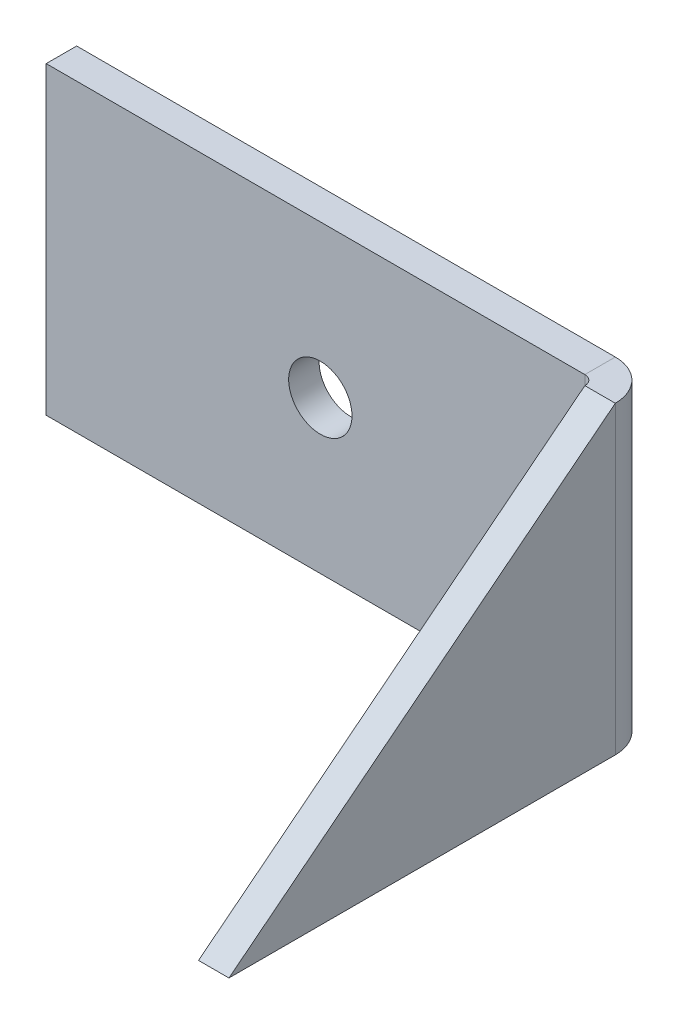
ISO-10303-21;
HEADER;
FILE_DESCRIPTION(('STEP AP214'),'2;1');
FILE_NAME('part.step','',(''),(''),'','','');
FILE_SCHEMA(('AUTOMOTIVE_DESIGN { 1 0 10303 214 1 1 1 1 }'));
ENDSEC;
DATA;
#1=APPLICATION_CONTEXT('core data for automotive mechanical design processes');
#2=APPLICATION_PROTOCOL_DEFINITION('international standard','automotive_design',2000,#1);
#3=PRODUCT_CONTEXT('',#1,'mechanical');
#4=PRODUCT('Part','Part','',(#3));
#5=PRODUCT_RELATED_PRODUCT_CATEGORY('part','',(#4));
#6=PRODUCT_DEFINITION_FORMATION('','',#4);
#7=PRODUCT_DEFINITION_CONTEXT('part definition',#1,'design');
#8=PRODUCT_DEFINITION('design','',#6,#7);
#9=PRODUCT_DEFINITION_SHAPE('','',#8);
#10=(LENGTH_UNIT() NAMED_UNIT(*) SI_UNIT(.MILLI.,.METRE.));
#11=(NAMED_UNIT(*) PLANE_ANGLE_UNIT() SI_UNIT($,.RADIAN.));
#12=(NAMED_UNIT(*) SI_UNIT($,.STERADIAN.) SOLID_ANGLE_UNIT());
#13=UNCERTAINTY_MEASURE_WITH_UNIT(LENGTH_MEASURE(1.E-05),#10,'distance_accuracy_value','');
#14=(GEOMETRIC_REPRESENTATION_CONTEXT(3) GLOBAL_UNCERTAINTY_ASSIGNED_CONTEXT((#13)) GLOBAL_UNIT_ASSIGNED_CONTEXT((#10,
#11,#12)) REPRESENTATION_CONTEXT('',''));
#15=CARTESIAN_POINT('',(0.,0.,0.));
#16=DIRECTION('',(0.,0.,1.));
#17=DIRECTION('',(1.,0.,0.));
#18=AXIS2_PLACEMENT_3D('',#15,#16,#17);
#19=CARTESIAN_POINT('',(-28.575,15.875,3.175));
#20=DIRECTION('',(0.,-1.,0.));
#21=DIRECTION('',(0.,0.,-1.));
#22=AXIS2_PLACEMENT_3D('',#19,#20,#21);
#23=PLANE('',#22);
#24=DIRECTION('',(0.,0.,-1.));
#25=VECTOR('',#24,1.);
#26=CARTESIAN_POINT('',(27.575,15.875,3.17499999999999));
#27=LINE('',#26,#25);
#28=CARTESIAN_POINT('',(27.575,15.875,3.175));
#29=VERTEX_POINT('',#28);
#30=CARTESIAN_POINT('',(27.575,15.875,0.));
#31=VERTEX_POINT('',#30);
#32=EDGE_CURVE('E141',#29,#31,#27,.T.);
#33=ORIENTED_EDGE('',*,*,#32,.T.);
#34=DIRECTION('',(-1.,0.,0.));
#35=VECTOR('',#34,1.);
#36=CARTESIAN_POINT('',(-28.575,15.875,0.));
#37=LINE('',#36,#35);
#38=CARTESIAN_POINT('',(-28.575,15.875,0.));
#39=VERTEX_POINT('',#38);
#40=EDGE_CURVE('E154',#31,#39,#37,.T.);
#41=ORIENTED_EDGE('',*,*,#40,.T.);
#42=DIRECTION('',(0.,0.,-1.));
#43=VECTOR('',#42,1.);
#44=CARTESIAN_POINT('',(-28.575,15.875,3.175));
#45=LINE('',#44,#43);
#46=CARTESIAN_POINT('',(-28.575,15.875,3.175));
#47=VERTEX_POINT('',#46);
#48=EDGE_CURVE('E11',#47,#39,#45,.T.);
#49=ORIENTED_EDGE('',*,*,#48,.F.);
#50=DIRECTION('',(-1.,0.,0.));
#51=VECTOR('',#50,1.);
#52=CARTESIAN_POINT('',(-28.575,15.875,3.175));
#53=LINE('',#52,#51);
#54=EDGE_CURVE('E158',#29,#47,#53,.T.);
#55=ORIENTED_EDGE('',*,*,#54,.F.);
#56=EDGE_LOOP('',(#33,#41,#49,#55));
#57=FACE_BOUND('',#56,.T.);
#58=ADVANCED_FACE('F43',(#57),#23,.F.);
#59=CARTESIAN_POINT('',(-28.575,-15.875,3.175));
#60=DIRECTION('',(0.,1.,0.));
#61=DIRECTION('',(0.,0.,1.));
#62=AXIS2_PLACEMENT_3D('',#59,#60,#61);
#63=PLANE('',#62);
#64=DIRECTION('',(0.,0.,-1.));
#65=VECTOR('',#64,1.);
#66=CARTESIAN_POINT('',(27.575,-15.875,3.17499999999999));
#67=LINE('',#66,#65);
#68=CARTESIAN_POINT('',(27.575,-15.875,3.175));
#69=VERTEX_POINT('',#68);
#70=CARTESIAN_POINT('',(27.575,-15.875,0.));
#71=VERTEX_POINT('',#70);
#72=EDGE_CURVE('E58',#69,#71,#67,.T.);
#73=ORIENTED_EDGE('',*,*,#72,.F.);
#74=DIRECTION('',(1.,0.,0.));
#75=VECTOR('',#74,1.);
#76=CARTESIAN_POINT('',(-28.575,-15.875,3.175));
#77=LINE('',#76,#75);
#78=CARTESIAN_POINT('',(-28.575,-15.875,3.175));
#79=VERTEX_POINT('',#78);
#80=EDGE_CURVE('E165',#79,#69,#77,.T.);
#81=ORIENTED_EDGE('',*,*,#80,.F.);
#82=DIRECTION('',(0.,0.,-1.));
#83=VECTOR('',#82,1.);
#84=CARTESIAN_POINT('',(-28.575,-15.875,3.175));
#85=LINE('',#84,#83);
#86=CARTESIAN_POINT('',(-28.575,-15.875,0.));
#87=VERTEX_POINT('',#86);
#88=EDGE_CURVE('E51',#79,#87,#85,.T.);
#89=ORIENTED_EDGE('',*,*,#88,.T.);
#90=DIRECTION('',(1.,0.,0.));
#91=VECTOR('',#90,1.);
#92=CARTESIAN_POINT('',(-28.575,-15.875,0.));
#93=LINE('',#92,#91);
#94=EDGE_CURVE('E162',#87,#71,#93,.T.);
#95=ORIENTED_EDGE('',*,*,#94,.T.);
#96=EDGE_LOOP('',(#73,#81,#89,#95));
#97=FACE_BOUND('',#96,.T.);
#98=ADVANCED_FACE('F178',(#97),#63,.F.);
#99=CARTESIAN_POINT('',(0.,0.,3.175));
#100=DIRECTION('',(0.,0.,1.));
#101=DIRECTION('',(1.,0.,0.));
#102=AXIS2_PLACEMENT_3D('',#99,#100,#101);
#103=PLANE('',#102);
#104=CARTESIAN_POINT('',(0.,0.,3.175));
#105=DIRECTION('',(0.,0.,1.));
#106=DIRECTION('',(1.,0.,0.));
#107=AXIS2_PLACEMENT_3D('',#104,#105,#106);
#108=CIRCLE('',#107,3.29999999999999);
#109=CARTESIAN_POINT('',(3.29999999999999,0.,3.175));
#110=VERTEX_POINT('',#109);
#111=EDGE_CURVE('E214',#110,#110,#108,.T.);
#112=ORIENTED_EDGE('',*,*,#111,.F.);
#113=EDGE_LOOP('',(#112));
#114=FACE_BOUND('',#113,.T.);
#115=ORIENTED_EDGE('',*,*,#80,.T.);
#116=DIRECTION('',(0.,1.,0.));
#117=VECTOR('',#116,1.);
#118=CARTESIAN_POINT('',(27.575,15.875,3.17499999999999));
#119=LINE('',#118,#117);
#120=EDGE_CURVE('E65',#29,#69,#119,.F.);
#121=ORIENTED_EDGE('',*,*,#120,.F.);
#122=ORIENTED_EDGE('',*,*,#54,.T.);
#123=DIRECTION('',(0.,-1.,0.));
#124=VECTOR('',#123,1.);
#125=CARTESIAN_POINT('',(-28.575,15.875,3.175));
#126=LINE('',#125,#124);
#127=EDGE_CURVE('E161',#47,#79,#126,.T.);
#128=ORIENTED_EDGE('',*,*,#127,.T.);
#129=EDGE_LOOP('',(#115,#121,#122,#128));
#130=FACE_BOUND('',#129,.T.);
#131=ADVANCED_FACE('F221',(#114,#130),#103,.T.);
#132=CARTESIAN_POINT('',(0.,0.,0.));
#133=DIRECTION('',(0.,0.,1.));
#134=DIRECTION('',(1.,0.,0.));
#135=AXIS2_PLACEMENT_3D('',#132,#133,#134);
#136=PLANE('',#135);
#137=CARTESIAN_POINT('',(0.,0.,0.));
#138=DIRECTION('',(0.,0.,1.));
#139=DIRECTION('',(1.,0.,0.));
#140=AXIS2_PLACEMENT_3D('',#137,#138,#139);
#141=CIRCLE('',#140,3.3);
#142=CARTESIAN_POINT('',(3.3,0.,0.));
#143=VERTEX_POINT('',#142);
#144=EDGE_CURVE('E127',#143,#143,#141,.T.);
#145=ORIENTED_EDGE('',*,*,#144,.T.);
#146=EDGE_LOOP('',(#145));
#147=FACE_BOUND('',#146,.T.);
#148=DIRECTION('',(0.,1.,0.));
#149=VECTOR('',#148,1.);
#150=CARTESIAN_POINT('',(27.575,15.875,0.));
#151=LINE('',#150,#149);
#152=EDGE_CURVE('E186',#31,#71,#151,.F.);
#153=ORIENTED_EDGE('',*,*,#152,.T.);
#154=ORIENTED_EDGE('',*,*,#94,.F.);
#155=DIRECTION('',(0.,-1.,0.));
#156=VECTOR('',#155,1.);
#157=CARTESIAN_POINT('',(-28.575,15.875,0.));
#158=LINE('',#157,#156);
#159=EDGE_CURVE('E170',#39,#87,#158,.T.);
#160=ORIENTED_EDGE('',*,*,#159,.F.);
#161=ORIENTED_EDGE('',*,*,#40,.F.);
#162=EDGE_LOOP('',(#153,#154,#160,#161));
#163=FACE_BOUND('',#162,.T.);
#164=ADVANCED_FACE('F183',(#147,#163),#136,.F.);
#165=CARTESIAN_POINT('',(-28.575,15.875,3.175));
#166=DIRECTION('',(1.,0.,0.));
#167=DIRECTION('',(0.,1.,0.));
#168=AXIS2_PLACEMENT_3D('',#165,#166,#167);
#169=PLANE('',#168);
#170=ORIENTED_EDGE('',*,*,#159,.T.);
#171=ORIENTED_EDGE('',*,*,#88,.F.);
#172=ORIENTED_EDGE('',*,*,#127,.F.);
#173=ORIENTED_EDGE('',*,*,#48,.T.);
#174=EDGE_LOOP('',(#170,#171,#172,#173));
#175=FACE_BOUND('',#174,.T.);
#176=ADVANCED_FACE('F248',(#175),#169,.F.);
#177=CARTESIAN_POINT('',(27.575,-15.875,4.175));
#178=DIRECTION('',(0.,-1.,0.));
#179=DIRECTION('',(0.,0.,-1.));
#180=AXIS2_PLACEMENT_3D('',#177,#178,#179);
#181=PLANE('',#180);
#182=DIRECTION('',(1.,0.,0.));
#183=VECTOR('',#182,1.);
#184=CARTESIAN_POINT('',(28.575,-15.875,4.17499999999999));
#185=LINE('',#184,#183);
#186=CARTESIAN_POINT('',(28.575,-15.875,4.17499999999999));
#187=VERTEX_POINT('',#186);
#188=CARTESIAN_POINT('',(31.75,-15.875,4.17499999999998));
#189=VERTEX_POINT('',#188);
#190=EDGE_CURVE('E137',#187,#189,#185,.T.);
#191=ORIENTED_EDGE('',*,*,#190,.F.);
#192=CARTESIAN_POINT('',(27.575,-15.875,4.175));
#193=DIRECTION('',(0.,1.,0.));
#194=DIRECTION('',(0.,0.,1.));
#195=AXIS2_PLACEMENT_3D('',#192,#193,#194);
#196=CIRCLE('',#195,1.);
#197=EDGE_CURVE('E135',#69,#187,#196,.F.);
#198=ORIENTED_EDGE('',*,*,#197,.F.);
#199=ORIENTED_EDGE('',*,*,#72,.T.);
#200=CARTESIAN_POINT('',(27.575,-15.875,4.175));
#201=DIRECTION('',(0.,1.,0.));
#202=DIRECTION('',(0.,0.,1.));
#203=AXIS2_PLACEMENT_3D('',#200,#201,#202);
#204=CIRCLE('',#203,4.175);
#205=EDGE_CURVE('E157',#71,#189,#204,.F.);
#206=ORIENTED_EDGE('',*,*,#205,.T.);
#207=EDGE_LOOP('',(#191,#198,#199,#206));
#208=FACE_BOUND('',#207,.T.);
#209=ADVANCED_FACE('F225',(#208),#181,.T.);
#210=CARTESIAN_POINT('',(27.575,15.875,4.175));
#211=DIRECTION('',(0.,-1.,0.));
#212=DIRECTION('',(0.,0.,-1.));
#213=AXIS2_PLACEMENT_3D('',#210,#211,#212);
#214=PLANE('',#213);
#215=CARTESIAN_POINT('',(27.575,15.875,4.175));
#216=DIRECTION('',(0.,1.,0.));
#217=DIRECTION('',(0.,0.,1.));
#218=AXIS2_PLACEMENT_3D('',#215,#216,#217);
#219=CIRCLE('',#218,1.);
#220=CARTESIAN_POINT('',(28.575,15.875,4.17499999999999));
#221=VERTEX_POINT('',#220);
#222=EDGE_CURVE('E133',#221,#29,#219,.T.);
#223=ORIENTED_EDGE('',*,*,#222,.F.);
#224=DIRECTION('',(1.,0.,0.));
#225=VECTOR('',#224,1.);
#226=CARTESIAN_POINT('',(28.575,15.875,4.17499999999999));
#227=LINE('',#226,#225);
#228=CARTESIAN_POINT('',(31.7500000000001,15.875,4.17499999999998));
#229=VERTEX_POINT('',#228);
#230=EDGE_CURVE('E103',#221,#229,#227,.T.);
#231=ORIENTED_EDGE('',*,*,#230,.T.);
#232=CARTESIAN_POINT('',(27.575,15.875,4.175));
#233=DIRECTION('',(0.,1.,0.));
#234=DIRECTION('',(0.,0.,1.));
#235=AXIS2_PLACEMENT_3D('',#232,#233,#234);
#236=CIRCLE('',#235,4.175);
#237=EDGE_CURVE('E190',#229,#31,#236,.T.);
#238=ORIENTED_EDGE('',*,*,#237,.T.);
#239=ORIENTED_EDGE('',*,*,#32,.F.);
#240=EDGE_LOOP('',(#223,#231,#238,#239));
#241=FACE_BOUND('',#240,.T.);
#242=ADVANCED_FACE('F140',(#241),#214,.F.);
#243=CARTESIAN_POINT('',(27.575,15.875,4.175));
#244=DIRECTION('',(0.,1.,0.));
#245=DIRECTION('',(1.,0.,0.));
#246=AXIS2_PLACEMENT_3D('',#243,#244,#245);
#247=CYLINDRICAL_SURFACE('',#246,4.175);
#248=ORIENTED_EDGE('',*,*,#152,.F.);
#249=ORIENTED_EDGE('',*,*,#237,.F.);
#250=DIRECTION('',(0.,-1.,0.));
#251=VECTOR('',#250,1.);
#252=CARTESIAN_POINT('',(31.75,0.,4.17499999999998));
#253=LINE('',#252,#251);
#254=EDGE_CURVE('E116',#229,#189,#253,.T.);
#255=ORIENTED_EDGE('',*,*,#254,.T.);
#256=ORIENTED_EDGE('',*,*,#205,.F.);
#257=EDGE_LOOP('',(#248,#249,#255,#256));
#258=FACE_BOUND('',#257,.T.);
#259=ADVANCED_FACE('F231',(#258),#247,.T.);
#260=CARTESIAN_POINT('',(27.575,15.875,4.175));
#261=DIRECTION('',(0.,1.,0.));
#262=DIRECTION('',(1.,0.,0.));
#263=AXIS2_PLACEMENT_3D('',#260,#261,#262);
#264=CYLINDRICAL_SURFACE('',#263,1.);
#265=ORIENTED_EDGE('',*,*,#120,.T.);
#266=ORIENTED_EDGE('',*,*,#197,.T.);
#267=DIRECTION('',(0.,1.,0.));
#268=VECTOR('',#267,1.);
#269=CARTESIAN_POINT('',(28.575,-15.875,4.17499999999999));
#270=LINE('',#269,#268);
#271=EDGE_CURVE('E117',#187,#221,#270,.T.);
#272=ORIENTED_EDGE('',*,*,#271,.T.);
#273=ORIENTED_EDGE('',*,*,#222,.T.);
#274=EDGE_LOOP('',(#265,#266,#272,#273));
#275=FACE_BOUND('',#274,.T.);
#276=ADVANCED_FACE('F132',(#275),#264,.F.);
#277=CARTESIAN_POINT('',(31.75,-15.875,3.17499999999999));
#278=DIRECTION('',(0.,1.,0.));
#279=DIRECTION('',(0.,0.,1.));
#280=AXIS2_PLACEMENT_3D('',#277,#278,#279);
#281=PLANE('',#280);
#282=ORIENTED_EDGE('',*,*,#190,.T.);
#283=DIRECTION('',(0.,0.,-1.));
#284=VECTOR('',#283,1.);
#285=CARTESIAN_POINT('',(31.75,-15.875,3.17499999999999));
#286=LINE('',#285,#284);
#287=CARTESIAN_POINT('',(31.7500000000001,-15.875,44.45));
#288=VERTEX_POINT('',#287);
#289=EDGE_CURVE('E148',#288,#189,#286,.T.);
#290=ORIENTED_EDGE('',*,*,#289,.F.);
#291=DIRECTION('',(-1.,0.,0.));
#292=VECTOR('',#291,1.);
#293=CARTESIAN_POINT('',(31.7500000000001,-15.875,44.45));
#294=LINE('',#293,#292);
#295=CARTESIAN_POINT('',(28.5750000000001,-15.875,44.45));
#296=VERTEX_POINT('',#295);
#297=EDGE_CURVE('E143',#288,#296,#294,.T.);
#298=ORIENTED_EDGE('',*,*,#297,.T.);
#299=DIRECTION('',(0.,0.,-1.));
#300=VECTOR('',#299,1.);
#301=CARTESIAN_POINT('',(28.575,-15.875,3.175));
#302=LINE('',#301,#300);
#303=EDGE_CURVE('E125',#296,#187,#302,.T.);
#304=ORIENTED_EDGE('',*,*,#303,.T.);
#305=EDGE_LOOP('',(#282,#290,#298,#304));
#306=FACE_BOUND('',#305,.T.);
#307=ADVANCED_FACE('F228',(#306),#281,.F.);
#308=CARTESIAN_POINT('',(31.75,0.,-1.11966295392247E-13));
#309=DIRECTION('',(-1.,0.,0.));
#310=DIRECTION('',(0.,0.,1.));
#311=AXIS2_PLACEMENT_3D('',#308,#309,#310);
#312=PLANE('',#311);
#313=ORIENTED_EDGE('',*,*,#254,.F.);
#314=DIRECTION('',(0.,-0.619090944115098,0.785319299975924));
#315=VECTOR('',#314,1.);
#316=CARTESIAN_POINT('',(31.75,11.8203501253857,9.31833932913693));
#317=LINE('',#316,#315);
#318=EDGE_CURVE('E109',#229,#288,#317,.T.);
#319=ORIENTED_EDGE('',*,*,#318,.T.);
#320=ORIENTED_EDGE('',*,*,#289,.T.);
#321=EDGE_LOOP('',(#313,#319,#320));
#322=FACE_BOUND('',#321,.T.);
#323=ADVANCED_FACE('F230',(#322),#312,.F.);
#324=CARTESIAN_POINT('',(28.575,0.,-1.0088084214142E-13));
#325=DIRECTION('',(-1.,0.,0.));
#326=DIRECTION('',(0.,0.,1.));
#327=AXIS2_PLACEMENT_3D('',#324,#325,#326);
#328=PLANE('',#327);
#329=DIRECTION('',(0.,-0.619090944115099,0.785319299975924));
#330=VECTOR('',#329,1.);
#331=CARTESIAN_POINT('',(28.575,11.8203501253857,9.31833932913695));
#332=LINE('',#331,#330);
#333=EDGE_CURVE('E106',#221,#296,#332,.T.);
#334=ORIENTED_EDGE('',*,*,#333,.F.);
#335=ORIENTED_EDGE('',*,*,#271,.F.);
#336=ORIENTED_EDGE('',*,*,#303,.F.);
#337=EDGE_LOOP('',(#334,#335,#336));
#338=FACE_BOUND('',#337,.T.);
#339=ADVANCED_FACE('F123',(#338),#328,.T.);
#340=CARTESIAN_POINT('',(31.750012,11.8203501253857,9.31833932913693));
#341=DIRECTION('',(0.,-0.785319299975924,-0.619090944115098));
#342=DIRECTION('',(0.,0.619090944115098,-0.785319299975924));
#343=AXIS2_PLACEMENT_3D('',#340,#341,#342);
#344=PLANE('',#343);
#345=ORIENTED_EDGE('',*,*,#230,.F.);
#346=ORIENTED_EDGE('',*,*,#333,.T.);
#347=ORIENTED_EDGE('',*,*,#297,.F.);
#348=ORIENTED_EDGE('',*,*,#318,.F.);
#349=EDGE_LOOP('',(#345,#346,#347,#348));
#350=FACE_BOUND('',#349,.T.);
#351=ADVANCED_FACE('F105',(#350),#344,.F.);
#352=CARTESIAN_POINT('',(0.,0.,3.175));
#353=DIRECTION('',(0.,0.,1.));
#354=DIRECTION('',(1.,0.,0.));
#355=AXIS2_PLACEMENT_3D('',#352,#353,#354);
#356=CYLINDRICAL_SURFACE('',#355,3.29999999999999);
#357=ORIENTED_EDGE('',*,*,#144,.F.);
#358=EDGE_LOOP('',(#357));
#359=FACE_BOUND('',#358,.T.);
#360=ORIENTED_EDGE('',*,*,#111,.T.);
#361=EDGE_LOOP('',(#360));
#362=FACE_BOUND('',#361,.T.);
#363=ADVANCED_FACE('F219',(#359,#362),#356,.F.);
#364=CLOSED_SHELL('',(#58,#98,#131,#164,#176,#209,#242,#259,#276,#307,#323,#339,#351,#363));
#365=MANIFOLD_SOLID_BREP('B2',#364);
#366=ADVANCED_BREP_SHAPE_REPRESENTATION('',(#18,#365),#14);
#367=SHAPE_DEFINITION_REPRESENTATION(#9,#366);
ENDSEC;
END-ISO-10303-21;
